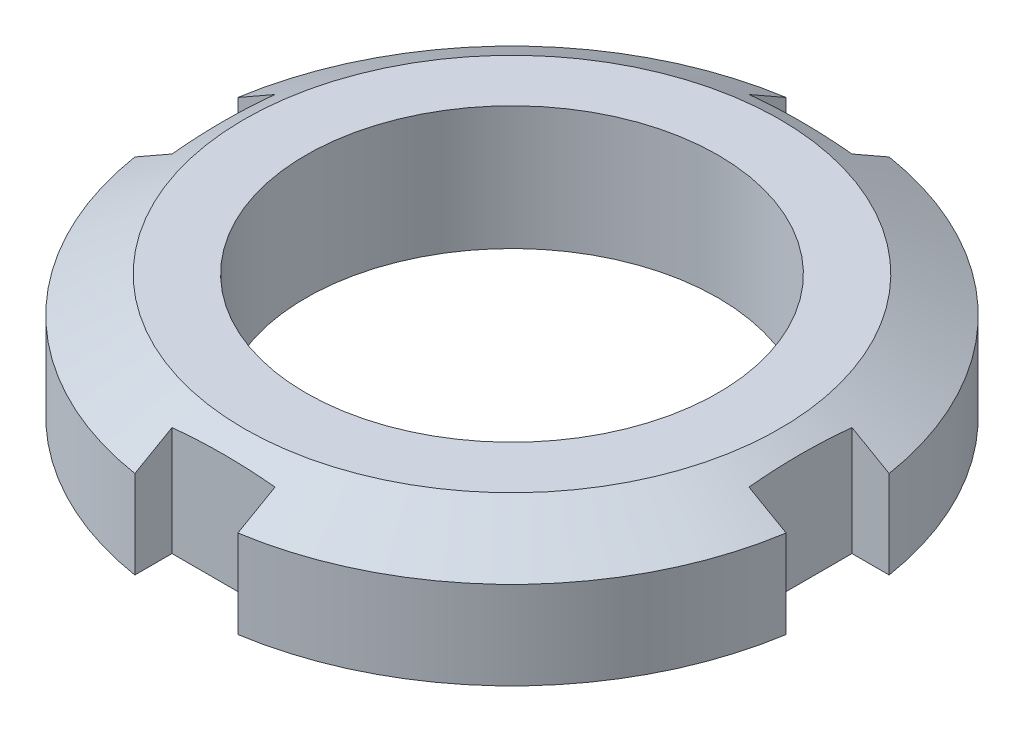
ISO-10303-21;
HEADER;
FILE_DESCRIPTION(('STEP AP214'),'2;1');
FILE_NAME('part.step','',(''),(''),'','','');
FILE_SCHEMA(('AUTOMOTIVE_DESIGN { 1 0 10303 214 1 1 1 1 }'));
ENDSEC;
DATA;
#1=APPLICATION_CONTEXT('core data for automotive mechanical design processes');
#2=APPLICATION_PROTOCOL_DEFINITION('international standard','automotive_design',2000,#1);
#3=PRODUCT_CONTEXT('',#1,'mechanical');
#4=PRODUCT('Part','Part','',(#3));
#5=PRODUCT_RELATED_PRODUCT_CATEGORY('part','',(#4));
#6=PRODUCT_DEFINITION_FORMATION('','',#4);
#7=PRODUCT_DEFINITION_CONTEXT('part definition',#1,'design');
#8=PRODUCT_DEFINITION('design','',#6,#7);
#9=PRODUCT_DEFINITION_SHAPE('','',#8);
#10=(LENGTH_UNIT() NAMED_UNIT(*) SI_UNIT(.MILLI.,.METRE.));
#11=(NAMED_UNIT(*) PLANE_ANGLE_UNIT() SI_UNIT($,.RADIAN.));
#12=(NAMED_UNIT(*) SI_UNIT($,.STERADIAN.) SOLID_ANGLE_UNIT());
#13=UNCERTAINTY_MEASURE_WITH_UNIT(LENGTH_MEASURE(1.E-05),#10,'distance_accuracy_value','');
#14=(GEOMETRIC_REPRESENTATION_CONTEXT(3) GLOBAL_UNCERTAINTY_ASSIGNED_CONTEXT((#13)) GLOBAL_UNIT_ASSIGNED_CONTEXT((#10,
#11,#12)) REPRESENTATION_CONTEXT('',''));
#15=CARTESIAN_POINT('',(0.,0.,0.));
#16=DIRECTION('',(0.,0.,1.));
#17=DIRECTION('',(1.,0.,0.));
#18=AXIS2_PLACEMENT_3D('',#15,#16,#17);
#19=CARTESIAN_POINT('',(0.,6.,0.));
#20=DIRECTION('',(0.,-1.,0.));
#21=DIRECTION('',(0.,0.,-1.));
#22=AXIS2_PLACEMENT_3D('',#19,#20,#21);
#23=CYLINDRICAL_SURFACE('',#22,16.);
#24=DIRECTION('',(0.,-1.,0.));
#25=VECTOR('',#24,1.);
#26=CARTESIAN_POINT('',(-2.5,6.,15.8034806292791));
#27=LINE('',#26,#25);
#28=CARTESIAN_POINT('',(-2.5,0.,15.8034806292791));
#29=VERTEX_POINT('',#28);
#30=CARTESIAN_POINT('',(-2.5,4.26794919243115,15.8034806292791));
#31=VERTEX_POINT('',#30);
#32=EDGE_CURVE('E174',#29,#31,#27,.F.);
#33=ORIENTED_EDGE('',*,*,#32,.T.);
#34=CARTESIAN_POINT('',(0.,4.26794919243115,0.));
#35=DIRECTION('',(0.,1.,0.));
#36=DIRECTION('',(0.,0.,1.));
#37=AXIS2_PLACEMENT_3D('',#34,#35,#36);
#38=CIRCLE('',#37,16.);
#39=CARTESIAN_POINT('',(-15.8034806292791,4.26794919243115,2.5));
#40=VERTEX_POINT('',#39);
#41=EDGE_CURVE('E169',#40,#31,#38,.T.);
#42=ORIENTED_EDGE('',*,*,#41,.F.);
#43=DIRECTION('',(0.,-1.,0.));
#44=VECTOR('',#43,1.);
#45=CARTESIAN_POINT('',(-15.8034806292791,6.,2.5));
#46=LINE('',#45,#44);
#47=CARTESIAN_POINT('',(-15.8034806292791,0.,2.5));
#48=VERTEX_POINT('',#47);
#49=EDGE_CURVE('E200',#40,#48,#46,.T.);
#50=ORIENTED_EDGE('',*,*,#49,.T.);
#51=CARTESIAN_POINT('',(0.,0.,0.));
#52=DIRECTION('',(0.,1.,0.));
#53=DIRECTION('',(0.,0.,1.));
#54=AXIS2_PLACEMENT_3D('',#51,#52,#53);
#55=CIRCLE('',#54,16.);
#56=EDGE_CURVE('E195',#48,#29,#55,.T.);
#57=ORIENTED_EDGE('',*,*,#56,.T.);
#58=EDGE_LOOP('',(#33,#42,#50,#57));
#59=FACE_BOUND('',#58,.T.);
#60=ADVANCED_FACE('F32',(#59),#23,.T.);
#61=DIRECTION('',(0.,-1.,0.));
#62=VECTOR('',#61,1.);
#63=CARTESIAN_POINT('',(2.5,6.,-15.8034806292791));
#64=LINE('',#63,#62);
#65=CARTESIAN_POINT('',(2.5,0.,-15.8034806292791));
#66=VERTEX_POINT('',#65);
#67=CARTESIAN_POINT('',(2.5,4.26794919243115,-15.8034806292791));
#68=VERTEX_POINT('',#67);
#69=EDGE_CURVE('E179',#66,#68,#64,.F.);
#70=ORIENTED_EDGE('',*,*,#69,.T.);
#71=CARTESIAN_POINT('',(15.8034806292791,4.26794919243115,-2.5));
#72=VERTEX_POINT('',#71);
#73=EDGE_CURVE('E167',#72,#68,#38,.T.);
#74=ORIENTED_EDGE('',*,*,#73,.F.);
#75=DIRECTION('',(0.,-1.,0.));
#76=VECTOR('',#75,1.);
#77=CARTESIAN_POINT('',(15.8034806292791,6.,-2.5));
#78=LINE('',#77,#76);
#79=CARTESIAN_POINT('',(15.8034806292791,0.,-2.5));
#80=VERTEX_POINT('',#79);
#81=EDGE_CURVE('E184',#72,#80,#78,.T.);
#82=ORIENTED_EDGE('',*,*,#81,.T.);
#83=EDGE_CURVE('E270',#80,#66,#55,.T.);
#84=ORIENTED_EDGE('',*,*,#83,.T.);
#85=EDGE_LOOP('',(#70,#74,#82,#84));
#86=FACE_BOUND('',#85,.T.);
#87=ADVANCED_FACE('F280',(#86),#23,.T.);
#88=DIRECTION('',(0.,-1.,0.));
#89=VECTOR('',#88,1.);
#90=CARTESIAN_POINT('',(-15.8034806292791,6.,-2.5));
#91=LINE('',#90,#89);
#92=CARTESIAN_POINT('',(-15.8034806292791,0.,-2.5));
#93=VERTEX_POINT('',#92);
#94=CARTESIAN_POINT('',(-15.8034806292791,4.26794919243115,-2.5));
#95=VERTEX_POINT('',#94);
#96=EDGE_CURVE('E58',#93,#95,#91,.F.);
#97=ORIENTED_EDGE('',*,*,#96,.T.);
#98=CARTESIAN_POINT('',(-2.5,4.26794919243115,-15.8034806292791));
#99=VERTEX_POINT('',#98);
#100=EDGE_CURVE('E402',#99,#95,#38,.T.);
#101=ORIENTED_EDGE('',*,*,#100,.F.);
#102=DIRECTION('',(0.,-1.,0.));
#103=VECTOR('',#102,1.);
#104=CARTESIAN_POINT('',(-2.5,6.,-15.8034806292791));
#105=LINE('',#104,#103);
#106=CARTESIAN_POINT('',(-2.5,0.,-15.8034806292791));
#107=VERTEX_POINT('',#106);
#108=EDGE_CURVE('E175',#99,#107,#105,.T.);
#109=ORIENTED_EDGE('',*,*,#108,.T.);
#110=EDGE_CURVE('E273',#107,#93,#55,.T.);
#111=ORIENTED_EDGE('',*,*,#110,.T.);
#112=EDGE_LOOP('',(#97,#101,#109,#111));
#113=FACE_BOUND('',#112,.T.);
#114=ADVANCED_FACE('F385',(#113),#23,.T.);
#115=CARTESIAN_POINT('',(0.,6.,0.));
#116=DIRECTION('',(0.,1.,0.));
#117=DIRECTION('',(0.,0.,1.));
#118=AXIS2_PLACEMENT_3D('',#115,#116,#117);
#119=PLANE('',#118);
#120=CARTESIAN_POINT('',(0.,6.,0.));
#121=DIRECTION('',(0.,1.,0.));
#122=DIRECTION('',(0.,0.,1.));
#123=AXIS2_PLACEMENT_3D('',#120,#121,#122);
#124=CIRCLE('',#123,13.);
#125=CARTESIAN_POINT('',(0.,6.,13.));
#126=VERTEX_POINT('',#125);
#127=EDGE_CURVE('E166',#126,#126,#124,.T.);
#128=ORIENTED_EDGE('',*,*,#127,.T.);
#129=EDGE_LOOP('',(#128));
#130=FACE_BOUND('',#129,.T.);
#131=CARTESIAN_POINT('',(0.,6.,0.));
#132=DIRECTION('',(0.,1.,0.));
#133=DIRECTION('',(0.,0.,1.));
#134=AXIS2_PLACEMENT_3D('',#131,#132,#133);
#135=CIRCLE('',#134,10.);
#136=CARTESIAN_POINT('',(0.,6.,10.));
#137=VERTEX_POINT('',#136);
#138=EDGE_CURVE('E267',#137,#137,#135,.T.);
#139=ORIENTED_EDGE('',*,*,#138,.F.);
#140=EDGE_LOOP('',(#139));
#141=FACE_BOUND('',#140,.T.);
#142=ADVANCED_FACE('F393',(#130,#141),#119,.T.);
#143=CARTESIAN_POINT('',(0.,0.,0.));
#144=DIRECTION('',(0.,1.,0.));
#145=DIRECTION('',(0.,0.,1.));
#146=AXIS2_PLACEMENT_3D('',#143,#144,#145);
#147=PLANE('',#146);
#148=ORIENTED_EDGE('',*,*,#56,.F.);
#149=DIRECTION('',(1.,0.,0.));
#150=VECTOR('',#149,1.);
#151=CARTESIAN_POINT('',(0.,0.,2.5));
#152=LINE('',#151,#150);
#153=CARTESIAN_POINT('',(-14.,0.,2.5));
#154=VERTEX_POINT('',#153);
#155=EDGE_CURVE('E45',#48,#154,#152,.T.);
#156=ORIENTED_EDGE('',*,*,#155,.T.);
#157=DIRECTION('',(0.,0.,-1.));
#158=VECTOR('',#157,1.);
#159=CARTESIAN_POINT('',(-14.,0.,2.5));
#160=LINE('',#159,#158);
#161=CARTESIAN_POINT('',(-14.,0.,-2.5));
#162=VERTEX_POINT('',#161);
#163=EDGE_CURVE('E193',#154,#162,#160,.T.);
#164=ORIENTED_EDGE('',*,*,#163,.T.);
#165=DIRECTION('',(-1.,0.,0.));
#166=VECTOR('',#165,1.);
#167=CARTESIAN_POINT('',(-14.,0.,-2.5));
#168=LINE('',#167,#166);
#169=EDGE_CURVE('E209',#162,#93,#168,.T.);
#170=ORIENTED_EDGE('',*,*,#169,.T.);
#171=ORIENTED_EDGE('',*,*,#110,.F.);
#172=DIRECTION('',(0.,0.,1.));
#173=VECTOR('',#172,1.);
#174=CARTESIAN_POINT('',(-2.5,0.,-16.));
#175=LINE('',#174,#173);
#176=CARTESIAN_POINT('',(-2.5,0.,-14.));
#177=VERTEX_POINT('',#176);
#178=EDGE_CURVE('E250',#107,#177,#175,.T.);
#179=ORIENTED_EDGE('',*,*,#178,.T.);
#180=DIRECTION('',(1.,0.,0.));
#181=VECTOR('',#180,1.);
#182=CARTESIAN_POINT('',(-2.5,0.,-14.));
#183=LINE('',#182,#181);
#184=CARTESIAN_POINT('',(2.5,0.,-14.));
#185=VERTEX_POINT('',#184);
#186=EDGE_CURVE('E254',#177,#185,#183,.T.);
#187=ORIENTED_EDGE('',*,*,#186,.T.);
#188=DIRECTION('',(0.,0.,-1.));
#189=VECTOR('',#188,1.);
#190=CARTESIAN_POINT('',(2.5,0.,-16.));
#191=LINE('',#190,#189);
#192=EDGE_CURVE('E257',#185,#66,#191,.T.);
#193=ORIENTED_EDGE('',*,*,#192,.T.);
#194=ORIENTED_EDGE('',*,*,#83,.F.);
#195=DIRECTION('',(-1.,0.,0.));
#196=VECTOR('',#195,1.);
#197=CARTESIAN_POINT('',(14.,0.,-2.5));
#198=LINE('',#197,#196);
#199=CARTESIAN_POINT('',(14.,0.,-2.5));
#200=VERTEX_POINT('',#199);
#201=EDGE_CURVE('E231',#80,#200,#198,.T.);
#202=ORIENTED_EDGE('',*,*,#201,.T.);
#203=DIRECTION('',(0.,0.,1.));
#204=VECTOR('',#203,1.);
#205=CARTESIAN_POINT('',(14.,0.,-2.5));
#206=LINE('',#205,#204);
#207=CARTESIAN_POINT('',(14.,0.,2.5));
#208=VERTEX_POINT('',#207);
#209=EDGE_CURVE('E225',#200,#208,#206,.T.);
#210=ORIENTED_EDGE('',*,*,#209,.T.);
#211=DIRECTION('',(1.,0.,0.));
#212=VECTOR('',#211,1.);
#213=CARTESIAN_POINT('',(14.,0.,2.5));
#214=LINE('',#213,#212);
#215=CARTESIAN_POINT('',(15.8034806292791,0.,2.5));
#216=VERTEX_POINT('',#215);
#217=EDGE_CURVE('E228',#208,#216,#214,.T.);
#218=ORIENTED_EDGE('',*,*,#217,.T.);
#219=CARTESIAN_POINT('',(2.5,0.,15.8034806292791));
#220=VERTEX_POINT('',#219);
#221=EDGE_CURVE('E275',#220,#216,#55,.T.);
#222=ORIENTED_EDGE('',*,*,#221,.F.);
#223=DIRECTION('',(0.,0.,-1.));
#224=VECTOR('',#223,1.);
#225=CARTESIAN_POINT('',(2.5,0.,14.));
#226=LINE('',#225,#224);
#227=CARTESIAN_POINT('',(2.5,0.,14.));
#228=VERTEX_POINT('',#227);
#229=EDGE_CURVE('E172',#220,#228,#226,.T.);
#230=ORIENTED_EDGE('',*,*,#229,.T.);
#231=DIRECTION('',(-1.,0.,0.));
#232=VECTOR('',#231,1.);
#233=CARTESIAN_POINT('',(-2.5,0.,14.));
#234=LINE('',#233,#232);
#235=CARTESIAN_POINT('',(-2.5,0.,14.));
#236=VERTEX_POINT('',#235);
#237=EDGE_CURVE('E243',#228,#236,#234,.T.);
#238=ORIENTED_EDGE('',*,*,#237,.T.);
#239=DIRECTION('',(0.,0.,1.));
#240=VECTOR('',#239,1.);
#241=CARTESIAN_POINT('',(-2.5,0.,14.));
#242=LINE('',#241,#240);
#243=EDGE_CURVE('E238',#236,#29,#242,.T.);
#244=ORIENTED_EDGE('',*,*,#243,.T.);
#245=EDGE_LOOP('',(#148,#156,#164,#170,#171,#179,#187,#193,#194,#202,#210,#218,#222,#230,#238,#244));
#246=FACE_BOUND('',#245,.T.);
#247=CARTESIAN_POINT('',(0.,0.,0.));
#248=DIRECTION('',(0.,1.,0.));
#249=DIRECTION('',(0.,0.,1.));
#250=AXIS2_PLACEMENT_3D('',#247,#248,#249);
#251=CIRCLE('',#250,10.);
#252=CARTESIAN_POINT('',(0.,0.,10.));
#253=VERTEX_POINT('',#252);
#254=EDGE_CURVE('E264',#253,#253,#251,.T.);
#255=ORIENTED_EDGE('',*,*,#254,.T.);
#256=EDGE_LOOP('',(#255));
#257=FACE_BOUND('',#256,.T.);
#258=ADVANCED_FACE('F190',(#246,#257),#147,.F.);
#259=DIRECTION('',(0.,-1.,0.));
#260=VECTOR('',#259,1.);
#261=CARTESIAN_POINT('',(15.8034806292791,6.,2.5));
#262=LINE('',#261,#260);
#263=CARTESIAN_POINT('',(15.8034806292791,4.26794919243115,2.5));
#264=VERTEX_POINT('',#263);
#265=EDGE_CURVE('E165',#216,#264,#262,.F.);
#266=ORIENTED_EDGE('',*,*,#265,.T.);
#267=CARTESIAN_POINT('',(2.5,4.26794919243115,15.8034806292791));
#268=VERTEX_POINT('',#267);
#269=EDGE_CURVE('E151',#268,#264,#38,.T.);
#270=ORIENTED_EDGE('',*,*,#269,.F.);
#271=DIRECTION('',(0.,-1.,0.));
#272=VECTOR('',#271,1.);
#273=CARTESIAN_POINT('',(2.5,6.,15.8034806292791));
#274=LINE('',#273,#272);
#275=EDGE_CURVE('E163',#268,#220,#274,.T.);
#276=ORIENTED_EDGE('',*,*,#275,.T.);
#277=ORIENTED_EDGE('',*,*,#221,.T.);
#278=EDGE_LOOP('',(#266,#270,#276,#277));
#279=FACE_BOUND('',#278,.T.);
#280=ADVANCED_FACE('F34',(#279),#23,.T.);
#281=CARTESIAN_POINT('',(0.,6.,0.));
#282=DIRECTION('',(0.,-1.,0.));
#283=DIRECTION('',(0.,0.,-1.));
#284=AXIS2_PLACEMENT_3D('',#281,#282,#283);
#285=CYLINDRICAL_SURFACE('',#284,10.);
#286=ORIENTED_EDGE('',*,*,#138,.T.);
#287=EDGE_LOOP('',(#286));
#288=FACE_BOUND('',#287,.T.);
#289=ORIENTED_EDGE('',*,*,#254,.F.);
#290=EDGE_LOOP('',(#289));
#291=FACE_BOUND('',#290,.T.);
#292=ADVANCED_FACE('F378',(#288,#291),#285,.F.);
#293=CARTESIAN_POINT('',(-2.5,0.,-16.));
#294=DIRECTION('',(-1.,0.,0.));
#295=DIRECTION('',(0.,0.,1.));
#296=AXIS2_PLACEMENT_3D('',#293,#294,#295);
#297=PLANE('',#296);
#298=ORIENTED_EDGE('',*,*,#108,.F.);
#299=CARTESIAN_POINT('',(-2.5,2.16507034063233,-19.4825479552166));
#300=CARTESIAN_POINT('',(-2.5,2.5411325270176,-18.8258109962527));
#301=CARTESIAN_POINT('',(-2.5,2.91699344856974,-18.1689585290866));
#302=CARTESIAN_POINT('',(-2.5,3.6680701789116,-16.8548868257767));
#303=CARTESIAN_POINT('',(-2.5,4.04328598910735,-16.1976675904365));
#304=CARTESIAN_POINT('',(-2.5,4.79283210724919,-14.8827227678909));
#305=CARTESIAN_POINT('',(-2.5,5.16716241389458,-14.2249971799435));
#306=CARTESIAN_POINT('',(-2.5,5.72765979989025,-13.2378410657639));
#307=CARTESIAN_POINT('',(-2.5,5.91432611862444,-12.9086940475096));
#308=CARTESIAN_POINT('',(-2.5,6.28723516231488,-12.2501599232052));
#309=CARTESIAN_POINT('',(-2.5,6.47347788703298,-11.9207728170201));
#310=CARTESIAN_POINT('',(-2.5,6.65946332694878,-11.5912403111433));
#311=B_SPLINE_CURVE_WITH_KNOTS('',3,(#299,#300,#301,#302,#303,#304,#305,#306,#307,#308,#309,
#310),.UNSPECIFIED.,.F.,.F.,(4,2,2,2,2,4),(0.,2.27036056791115,4.54071618127297,
6.81107512745911,7.94625706885341,9.0814396483116),.UNSPECIFIED.);
#312=CARTESIAN_POINT('',(-2.5,5.29478820829608,-14.));
#313=VERTEX_POINT('',#312);
#314=EDGE_CURVE('E210',#99,#313,#311,.T.);
#315=ORIENTED_EDGE('',*,*,#314,.T.);
#316=DIRECTION('',(0.,1.,0.));
#317=VECTOR('',#316,1.);
#318=CARTESIAN_POINT('',(-2.5,0.,-14.));
#319=LINE('',#318,#317);
#320=EDGE_CURVE('E260',#177,#313,#319,.T.);
#321=ORIENTED_EDGE('',*,*,#320,.F.);
#322=ORIENTED_EDGE('',*,*,#178,.F.);
#323=EDGE_LOOP('',(#298,#315,#321,#322));
#324=FACE_BOUND('',#323,.T.);
#325=ADVANCED_FACE('F373',(#324),#297,.F.);
#326=CARTESIAN_POINT('',(2.5,0.,-16.));
#327=DIRECTION('',(1.,0.,0.));
#328=DIRECTION('',(0.,0.,-1.));
#329=AXIS2_PLACEMENT_3D('',#326,#327,#328);
#330=PLANE('',#329);
#331=DIRECTION('',(0.,1.,0.));
#332=VECTOR('',#331,1.);
#333=CARTESIAN_POINT('',(2.5,0.,-14.));
#334=LINE('',#333,#332);
#335=CARTESIAN_POINT('',(2.5,5.29478820829608,-14.));
#336=VERTEX_POINT('',#335);
#337=EDGE_CURVE('E261',#185,#336,#334,.T.);
#338=ORIENTED_EDGE('',*,*,#337,.T.);
#339=CARTESIAN_POINT('',(2.5,6.65946332694879,-11.5912403111433));
#340=CARTESIAN_POINT('',(2.5,6.47347788703297,-11.9207728170201));
#341=CARTESIAN_POINT('',(2.5,6.28723516231488,-12.2501599232052));
#342=CARTESIAN_POINT('',(2.5,5.91432611862444,-12.9086940475096));
#343=CARTESIAN_POINT('',(2.5,5.72765979989025,-13.2378410657639));
#344=CARTESIAN_POINT('',(2.5,5.16716241389458,-14.2249971799435));
#345=CARTESIAN_POINT('',(2.5,4.79283210724919,-14.8827227678909));
#346=CARTESIAN_POINT('',(2.5,4.04328598910735,-16.1976675904365));
#347=CARTESIAN_POINT('',(2.5,3.6680701789116,-16.8548868257767));
#348=CARTESIAN_POINT('',(2.5,2.91699344856974,-18.1689585290866));
#349=CARTESIAN_POINT('',(2.5,2.5411325270176,-18.8258109962527));
#350=CARTESIAN_POINT('',(2.5,2.16507034063233,-19.4825479552166));
#351=B_SPLINE_CURVE_WITH_KNOTS('',3,(#339,#340,#341,#342,#343,#344,#345,#346,#347,#348,#349,
#350),.UNSPECIFIED.,.F.,.F.,(4,2,2,2,2,4),(0.,1.13518257945819,2.27036452085248,
4.54072346703862,6.81107908040045,9.0814396483116),.UNSPECIFIED.);
#352=EDGE_CURVE('E214',#336,#68,#351,.T.);
#353=ORIENTED_EDGE('',*,*,#352,.T.);
#354=ORIENTED_EDGE('',*,*,#69,.F.);
#355=ORIENTED_EDGE('',*,*,#192,.F.);
#356=EDGE_LOOP('',(#338,#353,#354,#355));
#357=FACE_BOUND('',#356,.T.);
#358=ADVANCED_FACE('F286',(#357),#330,.F.);
#359=CARTESIAN_POINT('',(-2.5,0.,-14.));
#360=DIRECTION('',(0.,0.,1.));
#361=DIRECTION('',(1.,0.,0.));
#362=AXIS2_PLACEMENT_3D('',#359,#360,#361);
#363=PLANE('',#362);
#364=ORIENTED_EDGE('',*,*,#320,.T.);
#365=CARTESIAN_POINT('',(-12.1189175023794,2.81493204217096,-14.));
#366=CARTESIAN_POINT('',(-11.7019924380798,2.97242966549874,-14.));
#367=CARTESIAN_POINT('',(-11.2835287957446,3.12594849195286,-14.));
#368=CARTESIAN_POINT('',(-10.4430765526394,3.42344320383286,-14.));
#369=CARTESIAN_POINT('',(-10.0210868503731,3.56741597133575,-14.));
#370=CARTESIAN_POINT('',(-9.17144133466471,3.84476981843219,-14.));
#371=CARTESIAN_POINT('',(-8.74376832670643,3.9780987275689,-14.));
#372=CARTESIAN_POINT('',(-7.88455923039116,4.23140127117242,-14.));
#373=CARTESIAN_POINT('',(-7.45302349100348,4.3513760991842,-14.));
#374=CARTESIAN_POINT('',(-6.17788887052795,4.68132180828034,-14.));
#375=CARTESIAN_POINT('',(-5.32841988194901,4.86982344902222,-14.));
#376=CARTESIAN_POINT('',(-4.04508804760457,5.09530424297949,-14.));
#377=CARTESIAN_POINT('',(-3.61615928689895,5.16088761741487,-14.));
#378=CARTESIAN_POINT('',(-2.75560182306364,5.27112270733664,-14.));
#379=CARTESIAN_POINT('',(-2.32397340142526,5.31577656943563,-14.));
#380=CARTESIAN_POINT('',(-1.57551921083756,5.37363929211549,-14.));
#381=CARTESIAN_POINT('',(-1.25908941123567,5.39207848234424,-14.));
#382=CARTESIAN_POINT('',(-0.625755699488492,5.41663526653947,-14.));
#383=CARTESIAN_POINT('',(-0.308851807370895,5.42275336706845,-14.));
#384=CARTESIAN_POINT('',(0.325190742547927,5.42254334299729,-14.));
#385=CARTESIAN_POINT('',(0.64232939599321,5.41620576915959,-14.));
#386=CARTESIAN_POINT('',(1.2761151752631,5.39119353088237,-14.));
#387=CARTESIAN_POINT('',(1.59276230392054,5.37251893781202,-14.));
#388=CARTESIAN_POINT('',(2.23181598629316,5.3226719583343,-14.));
#389=CARTESIAN_POINT('',(2.55420244203878,5.29124318921509,-14.));
#390=CARTESIAN_POINT('',(3.19760953994565,5.21649707166657,-14.));
#391=CARTESIAN_POINT('',(3.51863008558635,5.17317889680169,-14.));
#392=CARTESIAN_POINT('',(4.15866412234546,5.07546163449521,-14.));
#393=CARTESIAN_POINT('',(4.47767919297369,5.02107281546876,-14.));
#394=CARTESIAN_POINT('',(5.11373051209544,4.90207409265497,-14.));
#395=CARTESIAN_POINT('',(5.43076717267612,4.83746639663069,-14.));
#396=CARTESIAN_POINT('',(5.74674824775161,4.76817945796893,-14.));
#397=B_SPLINE_CURVE_WITH_KNOTS('',3,(#365,#366,#367,#368,#369,#370,#371,#372,#373,#374,#375,
#376,#377,#378,#379,#380,#381,#382,#383,#384,#385,#386,#387,#388,#389,#390,#391,#392,#393,#394,
#395,#396),.UNSPECIFIED.,.F.,.F.,(4,2,2,2,2,2,2,2,2,2,2,2,2,2,2,4),(0.,1.33707055347523,
2.67457568978561,4.01827847837507,5.36186107451758,7.96896390144178,9.27029621011378,
10.5714950198354,11.5221753550948,12.4728166038085,13.4241793150582,14.3755365227611,
15.3470480863248,16.3186271970099,17.2893092068677,18.2597817890196),.UNSPECIFIED.);
#398=EDGE_CURVE('E293',#313,#336,#397,.T.);
#399=ORIENTED_EDGE('',*,*,#398,.T.);
#400=ORIENTED_EDGE('',*,*,#337,.F.);
#401=ORIENTED_EDGE('',*,*,#186,.F.);
#402=EDGE_LOOP('',(#364,#399,#400,#401));
#403=FACE_BOUND('',#402,.T.);
#404=ADVANCED_FACE('F291',(#403),#363,.F.);
#405=CARTESIAN_POINT('',(-2.5,0.,14.));
#406=DIRECTION('',(-1.,0.,0.));
#407=DIRECTION('',(0.,0.,1.));
#408=AXIS2_PLACEMENT_3D('',#405,#406,#407);
#409=PLANE('',#408);
#410=DIRECTION('',(0.,1.,0.));
#411=VECTOR('',#410,1.);
#412=CARTESIAN_POINT('',(-2.5,0.,14.));
#413=LINE('',#412,#411);
#414=CARTESIAN_POINT('',(-2.5,5.29478820829608,14.));
#415=VERTEX_POINT('',#414);
#416=EDGE_CURVE('E247',#236,#415,#413,.T.);
#417=ORIENTED_EDGE('',*,*,#416,.T.);
#418=CARTESIAN_POINT('',(-2.5,7.34119933050626,10.3801631471322));
#419=CARTESIAN_POINT('',(-2.5,7.15597967127348,10.7101279941343));
#420=CARTESIAN_POINT('',(-2.5,6.97040843909757,11.0398951212743));
#421=CARTESIAN_POINT('',(-2.5,6.59869651618256,11.6991078653206));
#422=CARTESIAN_POINT('',(-2.5,6.41255582604503,12.028553482566));
#423=CARTESIAN_POINT('',(-2.5,5.85348084485253,13.0165176512058));
#424=CARTESIAN_POINT('',(-2.5,5.47989231555224,13.6746658798882));
#425=CARTESIAN_POINT('',(-2.5,4.7315958527932,14.990322844317));
#426=CARTESIAN_POINT('',(-2.5,4.35688792225582,15.6478315817264));
#427=CARTESIAN_POINT('',(-2.5,3.60667349540547,16.9623965380085));
#428=CARTESIAN_POINT('',(-2.5,3.23116699622715,17.6194527552464));
#429=CARTESIAN_POINT('',(-2.5,2.85542346530015,18.2763729780794));
#430=B_SPLINE_CURVE_WITH_KNOTS('',3,(#418,#419,#420,#421,#422,#423,#424,#425,#426,#427,#428,
#429),.UNSPECIFIED.,.F.,.F.,(4,2,2,2,2,4),(0.,1.13518568331668,2.27037016786421,
4.54073101281753,6.81108593784519,9.08144902292915),.UNSPECIFIED.);
#431=EDGE_CURVE('E158',#415,#31,#430,.T.);
#432=ORIENTED_EDGE('',*,*,#431,.T.);
#433=ORIENTED_EDGE('',*,*,#32,.F.);
#434=ORIENTED_EDGE('',*,*,#243,.F.);
#435=EDGE_LOOP('',(#417,#432,#433,#434));
#436=FACE_BOUND('',#435,.T.);
#437=ADVANCED_FACE('F366',(#436),#409,.F.);
#438=CARTESIAN_POINT('',(2.5,0.,14.));
#439=DIRECTION('',(1.,0.,0.));
#440=DIRECTION('',(0.,0.,-1.));
#441=AXIS2_PLACEMENT_3D('',#438,#439,#440);
#442=PLANE('',#441);
#443=ORIENTED_EDGE('',*,*,#275,.F.);
#444=CARTESIAN_POINT('',(2.5,2.85542346530015,18.2763729780794));
#445=CARTESIAN_POINT('',(2.5,3.23116699622709,17.6194527552465));
#446=CARTESIAN_POINT('',(2.5,3.60667349540536,16.9623965380087));
#447=CARTESIAN_POINT('',(2.5,4.35688792225561,15.6478315817268));
#448=CARTESIAN_POINT('',(2.5,4.73159585279293,14.9903228443174));
#449=CARTESIAN_POINT('',(2.5,5.47989231555197,13.6746658798887));
#450=CARTESIAN_POINT('',(2.5,5.85348084485232,13.0165176512062));
#451=CARTESIAN_POINT('',(2.5,6.41255582604489,12.0285534825662));
#452=CARTESIAN_POINT('',(2.5,6.59869651618245,11.6991078653208));
#453=CARTESIAN_POINT('',(2.5,6.97040843909751,11.0398951212744));
#454=CARTESIAN_POINT('',(2.5,7.15597967127345,10.7101279941343));
#455=CARTESIAN_POINT('',(2.5,7.34119933050625,10.3801631471322));
#456=B_SPLINE_CURVE_WITH_KNOTS('',3,(#444,#445,#446,#447,#448,#449,#450,#451,#452,#453,#454,
#455),.UNSPECIFIED.,.F.,.F.,(4,2,2,2,2,4),(0.,2.27036308508364,4.54071801011097,
6.81107885506462,7.94626333961231,9.08144902292915),.UNSPECIFIED.);
#457=CARTESIAN_POINT('',(2.5,5.29478820829608,14.));
#458=VERTEX_POINT('',#457);
#459=EDGE_CURVE('E148',#268,#458,#456,.T.);
#460=ORIENTED_EDGE('',*,*,#459,.T.);
#461=DIRECTION('',(0.,1.,0.));
#462=VECTOR('',#461,1.);
#463=CARTESIAN_POINT('',(2.5,0.,14.));
#464=LINE('',#463,#462);
#465=EDGE_CURVE('E246',#228,#458,#464,.T.);
#466=ORIENTED_EDGE('',*,*,#465,.F.);
#467=ORIENTED_EDGE('',*,*,#229,.F.);
#468=EDGE_LOOP('',(#443,#460,#466,#467));
#469=FACE_BOUND('',#468,.T.);
#470=ADVANCED_FACE('F170',(#469),#442,.F.);
#471=CARTESIAN_POINT('',(-2.5,0.,14.));
#472=DIRECTION('',(0.,0.,-1.));
#473=DIRECTION('',(-1.,0.,0.));
#474=AXIS2_PLACEMENT_3D('',#471,#472,#473);
#475=PLANE('',#474);
#476=ORIENTED_EDGE('',*,*,#465,.T.);
#477=CARTESIAN_POINT('',(5.74674824775161,4.76817945796893,14.));
#478=CARTESIAN_POINT('',(5.43076717267613,4.83746639663069,14.));
#479=CARTESIAN_POINT('',(5.11373051209544,4.90207409265497,14.));
#480=CARTESIAN_POINT('',(4.47767919297369,5.02107281546876,14.));
#481=CARTESIAN_POINT('',(4.15866412234546,5.07546163449521,14.));
#482=CARTESIAN_POINT('',(3.51863008558636,5.17317889680169,14.));
#483=CARTESIAN_POINT('',(3.19760953994566,5.21649707166656,14.));
#484=CARTESIAN_POINT('',(2.55420244203879,5.29124318921509,14.));
#485=CARTESIAN_POINT('',(2.23181598629317,5.3226719583343,14.));
#486=CARTESIAN_POINT('',(1.59276230392055,5.37251893781202,14.));
#487=CARTESIAN_POINT('',(1.27611517526311,5.39119353088237,14.));
#488=CARTESIAN_POINT('',(0.642329395993215,5.41620576915959,14.));
#489=CARTESIAN_POINT('',(0.325190742547932,5.42254334299729,14.));
#490=CARTESIAN_POINT('',(-0.30885180737089,5.42275336706845,14.));
#491=CARTESIAN_POINT('',(-0.625755699488486,5.41663526653947,14.));
#492=CARTESIAN_POINT('',(-1.25908941123566,5.39207848234424,14.));
#493=CARTESIAN_POINT('',(-1.57551921083755,5.37363929211549,14.));
#494=CARTESIAN_POINT('',(-2.32397340142526,5.31577656943563,14.));
#495=CARTESIAN_POINT('',(-2.75560182306364,5.27112270733664,14.));
#496=CARTESIAN_POINT('',(-3.61615928689895,5.16088761741487,14.));
#497=CARTESIAN_POINT('',(-4.04508804760457,5.09530424297949,14.));
#498=CARTESIAN_POINT('',(-5.32841988194901,4.86982344902222,14.));
#499=CARTESIAN_POINT('',(-6.17788887052795,4.68132180828034,14.));
#500=CARTESIAN_POINT('',(-7.45302349100348,4.3513760991842,14.));
#501=CARTESIAN_POINT('',(-7.88455923039116,4.23140127117242,14.));
#502=CARTESIAN_POINT('',(-8.74376832670643,3.9780987275689,14.));
#503=CARTESIAN_POINT('',(-9.17144133466471,3.84476981843219,14.));
#504=CARTESIAN_POINT('',(-10.0210868503731,3.56741597133575,14.));
#505=CARTESIAN_POINT('',(-10.4430765526394,3.42344320383286,14.));
#506=CARTESIAN_POINT('',(-11.2835287957446,3.12594849195286,14.));
#507=CARTESIAN_POINT('',(-11.7019924380798,2.97242966549874,14.));
#508=CARTESIAN_POINT('',(-12.1189175023794,2.81493204217096,14.));
#509=B_SPLINE_CURVE_WITH_KNOTS('',3,(#477,#478,#479,#480,#481,#482,#483,#484,#485,#486,#487,
#488,#489,#490,#491,#492,#493,#494,#495,#496,#497,#498,#499,#500,#501,#502,#503,#504,#505,#506,
#507,#508),.UNSPECIFIED.,.F.,.F.,(4,2,2,2,2,2,2,2,2,2,2,2,2,2,2,4),(0.,0.970472582151847,
1.94115459200967,2.91273370269475,3.88424526625852,4.83560247396136,5.78696518521113,
6.73760643392483,7.68828676918424,8.98948557890582,10.2908178875778,12.897920714502,
14.2415033106445,15.585206099234,16.9227112355444,18.2597817890196),.UNSPECIFIED.);
#510=EDGE_CURVE('E154',#458,#415,#509,.T.);
#511=ORIENTED_EDGE('',*,*,#510,.T.);
#512=ORIENTED_EDGE('',*,*,#416,.F.);
#513=ORIENTED_EDGE('',*,*,#237,.F.);
#514=EDGE_LOOP('',(#476,#511,#512,#513));
#515=FACE_BOUND('',#514,.T.);
#516=ADVANCED_FACE('F365',(#515),#475,.F.);
#517=CARTESIAN_POINT('',(14.,0.,-2.5));
#518=DIRECTION('',(0.,0.,-1.));
#519=DIRECTION('',(-1.,0.,0.));
#520=AXIS2_PLACEMENT_3D('',#517,#518,#519);
#521=PLANE('',#520);
#522=ORIENTED_EDGE('',*,*,#81,.F.);
#523=CARTESIAN_POINT('',(18.2763729780794,2.85542346530015,-2.5));
#524=CARTESIAN_POINT('',(17.6194527552465,3.23116699622709,-2.5));
#525=CARTESIAN_POINT('',(16.9623965380087,3.60667349540536,-2.5));
#526=CARTESIAN_POINT('',(15.6478315817268,4.35688792225561,-2.5));
#527=CARTESIAN_POINT('',(14.9903228443174,4.73159585279293,-2.5));
#528=CARTESIAN_POINT('',(13.6746658798887,5.47989231555197,-2.5));
#529=CARTESIAN_POINT('',(13.0165176512062,5.85348084485232,-2.5));
#530=CARTESIAN_POINT('',(12.0285534825662,6.41255582604489,-2.5));
#531=CARTESIAN_POINT('',(11.6991078653208,6.59869651618245,-2.5));
#532=CARTESIAN_POINT('',(11.0398951212744,6.97040843909751,-2.5));
#533=CARTESIAN_POINT('',(10.7101279941343,7.15597967127345,-2.5));
#534=CARTESIAN_POINT('',(10.3801631471322,7.34119933050625,-2.5));
#535=B_SPLINE_CURVE_WITH_KNOTS('',3,(#523,#524,#525,#526,#527,#528,#529,#530,#531,#532,#533,
#534),.UNSPECIFIED.,.F.,.F.,(4,2,2,2,2,4),(0.,2.27036308508364,4.54071801011097,
6.81107885506462,7.94626333961231,9.08144902292915),.UNSPECIFIED.);
#536=CARTESIAN_POINT('',(14.,5.29478820829608,-2.5));
#537=VERTEX_POINT('',#536);
#538=EDGE_CURVE('E346',#72,#537,#535,.T.);
#539=ORIENTED_EDGE('',*,*,#538,.T.);
#540=DIRECTION('',(0.,1.,0.));
#541=VECTOR('',#540,1.);
#542=CARTESIAN_POINT('',(14.,0.,-2.5));
#543=LINE('',#542,#541);
#544=EDGE_CURVE('E235',#200,#537,#543,.T.);
#545=ORIENTED_EDGE('',*,*,#544,.F.);
#546=ORIENTED_EDGE('',*,*,#201,.F.);
#547=EDGE_LOOP('',(#522,#539,#545,#546));
#548=FACE_BOUND('',#547,.T.);
#549=ADVANCED_FACE('F426',(#548),#521,.F.);
#550=CARTESIAN_POINT('',(14.,0.,2.5));
#551=DIRECTION('',(0.,0.,1.));
#552=DIRECTION('',(1.,0.,0.));
#553=AXIS2_PLACEMENT_3D('',#550,#551,#552);
#554=PLANE('',#553);
#555=DIRECTION('',(0.,1.,0.));
#556=VECTOR('',#555,1.);
#557=CARTESIAN_POINT('',(14.,0.,2.5));
#558=LINE('',#557,#556);
#559=CARTESIAN_POINT('',(14.,5.29478820829608,2.5));
#560=VERTEX_POINT('',#559);
#561=EDGE_CURVE('E234',#208,#560,#558,.T.);
#562=ORIENTED_EDGE('',*,*,#561,.T.);
#563=CARTESIAN_POINT('',(10.3801631471322,7.34119933050626,2.5));
#564=CARTESIAN_POINT('',(10.7101279941343,7.15597967127348,2.5));
#565=CARTESIAN_POINT('',(11.0398951212743,6.97040843909757,2.5));
#566=CARTESIAN_POINT('',(11.6991078653206,6.59869651618256,2.5));
#567=CARTESIAN_POINT('',(12.028553482566,6.41255582604503,2.5));
#568=CARTESIAN_POINT('',(13.0165176512058,5.85348084485253,2.5));
#569=CARTESIAN_POINT('',(13.6746658798882,5.47989231555224,2.5));
#570=CARTESIAN_POINT('',(14.990322844317,4.7315958527932,2.5));
#571=CARTESIAN_POINT('',(15.6478315817264,4.35688792225582,2.5));
#572=CARTESIAN_POINT('',(16.9623965380085,3.60667349540547,2.5));
#573=CARTESIAN_POINT('',(17.6194527552464,3.23116699622715,2.5));
#574=CARTESIAN_POINT('',(18.2763729780794,2.85542346530015,2.5));
#575=B_SPLINE_CURVE_WITH_KNOTS('',3,(#563,#564,#565,#566,#567,#568,#569,#570,#571,#572,#573,
#574),.UNSPECIFIED.,.F.,.F.,(4,2,2,2,2,4),(0.,1.13518568331668,2.27037016786421,
4.54073101281753,6.81108593784519,9.08144902292915),.UNSPECIFIED.);
#576=EDGE_CURVE('E339',#560,#264,#575,.T.);
#577=ORIENTED_EDGE('',*,*,#576,.T.);
#578=ORIENTED_EDGE('',*,*,#265,.F.);
#579=ORIENTED_EDGE('',*,*,#217,.F.);
#580=EDGE_LOOP('',(#562,#577,#578,#579));
#581=FACE_BOUND('',#580,.T.);
#582=ADVANCED_FACE('F423',(#581),#554,.F.);
#583=CARTESIAN_POINT('',(14.,0.,-2.5));
#584=DIRECTION('',(-1.,0.,0.));
#585=DIRECTION('',(0.,0.,1.));
#586=AXIS2_PLACEMENT_3D('',#583,#584,#585);
#587=PLANE('',#586);
#588=ORIENTED_EDGE('',*,*,#544,.T.);
#589=CARTESIAN_POINT('',(14.,2.81493204217096,-12.1189175023794));
#590=CARTESIAN_POINT('',(14.,2.97242966549874,-11.7019924380798));
#591=CARTESIAN_POINT('',(14.,3.12594849195286,-11.2835287957446));
#592=CARTESIAN_POINT('',(14.,3.42344320383286,-10.4430765526394));
#593=CARTESIAN_POINT('',(14.,3.56741597133575,-10.0210868503731));
#594=CARTESIAN_POINT('',(14.,3.84476981843219,-9.17144133466471));
#595=CARTESIAN_POINT('',(14.,3.9780987275689,-8.74376832670643));
#596=CARTESIAN_POINT('',(14.,4.23140127117242,-7.88455923039116));
#597=CARTESIAN_POINT('',(14.,4.3513760991842,-7.45302349100348));
#598=CARTESIAN_POINT('',(14.,4.68132180828034,-6.17788887052795));
#599=CARTESIAN_POINT('',(14.,4.86982344902222,-5.32841988194901));
#600=CARTESIAN_POINT('',(14.,5.09530424297949,-4.04508804760457));
#601=CARTESIAN_POINT('',(14.,5.16088761741487,-3.61615928689895));
#602=CARTESIAN_POINT('',(14.,5.27112270733664,-2.75560182306364));
#603=CARTESIAN_POINT('',(14.,5.31577656943563,-2.32397340142526));
#604=CARTESIAN_POINT('',(14.,5.37363929211549,-1.57551921083756));
#605=CARTESIAN_POINT('',(14.,5.39207848234424,-1.25908941123566));
#606=CARTESIAN_POINT('',(14.,5.41663526653947,-0.625755699488488));
#607=CARTESIAN_POINT('',(14.,5.42275336706845,-0.308851807370892));
#608=CARTESIAN_POINT('',(14.,5.42254334299729,0.325190742547929));
#609=CARTESIAN_POINT('',(14.,5.41620576915959,0.642329395993212));
#610=CARTESIAN_POINT('',(14.,5.39119353088237,1.2761151752631));
#611=CARTESIAN_POINT('',(14.,5.37251893781202,1.59276230392054));
#612=CARTESIAN_POINT('',(14.,5.3226719583343,2.23181598629317));
#613=CARTESIAN_POINT('',(14.,5.29124318921509,2.55420244203878));
#614=CARTESIAN_POINT('',(14.,5.21649707166656,3.19760953994565));
#615=CARTESIAN_POINT('',(14.,5.17317889680169,3.51863008558635));
#616=CARTESIAN_POINT('',(14.,5.07546163449521,4.15866412234546));
#617=CARTESIAN_POINT('',(14.,5.02107281546876,4.47767919297369));
#618=CARTESIAN_POINT('',(14.,4.90207409265497,5.11373051209544));
#619=CARTESIAN_POINT('',(14.,4.83746639663069,5.43076717267612));
#620=CARTESIAN_POINT('',(14.,4.76817945796893,5.74674824775161));
#621=B_SPLINE_CURVE_WITH_KNOTS('',3,(#589,#590,#591,#592,#593,#594,#595,#596,#597,#598,#599,
#600,#601,#602,#603,#604,#605,#606,#607,#608,#609,#610,#611,#612,#613,#614,#615,#616,#617,#618,
#619,#620),.UNSPECIFIED.,.F.,.F.,(4,2,2,2,2,2,2,2,2,2,2,2,2,2,2,4),(0.,1.33707055347523,
2.67457568978561,4.01827847837507,5.36186107451758,7.96896390144178,9.27029621011378,
10.5714950198354,11.5221753550948,12.4728166038085,13.4241793150582,14.3755365227611,
15.3470480863248,16.3186271970099,17.2893092068677,18.2597817890196),.UNSPECIFIED.);
#622=EDGE_CURVE('E332',#537,#560,#621,.T.);
#623=ORIENTED_EDGE('',*,*,#622,.T.);
#624=ORIENTED_EDGE('',*,*,#561,.F.);
#625=ORIENTED_EDGE('',*,*,#209,.F.);
#626=EDGE_LOOP('',(#588,#623,#624,#625));
#627=FACE_BOUND('',#626,.T.);
#628=ADVANCED_FACE('F424',(#627),#587,.F.);
#629=CARTESIAN_POINT('',(-14.,0.,2.5));
#630=DIRECTION('',(0.,0.,1.));
#631=DIRECTION('',(1.,0.,0.));
#632=AXIS2_PLACEMENT_3D('',#629,#630,#631);
#633=PLANE('',#632);
#634=ORIENTED_EDGE('',*,*,#49,.F.);
#635=CARTESIAN_POINT('',(-19.4825479552166,2.16507034063233,2.5));
#636=CARTESIAN_POINT('',(-18.8258109962527,2.5411325270176,2.5));
#637=CARTESIAN_POINT('',(-18.1689585290866,2.91699344856974,2.5));
#638=CARTESIAN_POINT('',(-16.8548868257767,3.6680701789116,2.5));
#639=CARTESIAN_POINT('',(-16.1976675904365,4.04328598910735,2.5));
#640=CARTESIAN_POINT('',(-14.8827227678909,4.79283210724919,2.5));
#641=CARTESIAN_POINT('',(-14.2249971799435,5.16716241389458,2.5));
#642=CARTESIAN_POINT('',(-13.2378410657639,5.72765979989025,2.5));
#643=CARTESIAN_POINT('',(-12.9086940475096,5.91432611862444,2.5));
#644=CARTESIAN_POINT('',(-12.2501599232052,6.28723516231488,2.5));
#645=CARTESIAN_POINT('',(-11.9207728170201,6.47347788703298,2.5));
#646=CARTESIAN_POINT('',(-11.5912403111433,6.65946332694878,2.5));
#647=B_SPLINE_CURVE_WITH_KNOTS('',3,(#635,#636,#637,#638,#639,#640,#641,#642,#643,#644,#645,
#646),.UNSPECIFIED.,.F.,.F.,(4,2,2,2,2,4),(0.,2.27036056791115,4.54071618127297,
6.81107512745911,7.94625706885341,9.0814396483116),.UNSPECIFIED.);
#648=CARTESIAN_POINT('',(-14.,5.29478820829608,2.5));
#649=VERTEX_POINT('',#648);
#650=EDGE_CURVE('E203',#40,#649,#647,.T.);
#651=ORIENTED_EDGE('',*,*,#650,.T.);
#652=DIRECTION('',(0.,1.,0.));
#653=VECTOR('',#652,1.);
#654=CARTESIAN_POINT('',(-14.,0.,2.5));
#655=LINE('',#654,#653);
#656=EDGE_CURVE('E202',#154,#649,#655,.T.);
#657=ORIENTED_EDGE('',*,*,#656,.F.);
#658=ORIENTED_EDGE('',*,*,#155,.F.);
#659=EDGE_LOOP('',(#634,#651,#657,#658));
#660=FACE_BOUND('',#659,.T.);
#661=ADVANCED_FACE('F198',(#660),#633,.F.);
#662=CARTESIAN_POINT('',(-14.,0.,-2.5));
#663=DIRECTION('',(0.,0.,-1.));
#664=DIRECTION('',(-1.,0.,0.));
#665=AXIS2_PLACEMENT_3D('',#662,#663,#664);
#666=PLANE('',#665);
#667=DIRECTION('',(0.,1.,0.));
#668=VECTOR('',#667,1.);
#669=CARTESIAN_POINT('',(-14.,0.,-2.5));
#670=LINE('',#669,#668);
#671=CARTESIAN_POINT('',(-14.,5.29478820829608,-2.5));
#672=VERTEX_POINT('',#671);
#673=EDGE_CURVE('E205',#162,#672,#670,.T.);
#674=ORIENTED_EDGE('',*,*,#673,.T.);
#675=CARTESIAN_POINT('',(-11.5912403111433,6.65946332694879,-2.5));
#676=CARTESIAN_POINT('',(-11.9207728170201,6.47347788703297,-2.5));
#677=CARTESIAN_POINT('',(-12.2501599232052,6.28723516231488,-2.5));
#678=CARTESIAN_POINT('',(-12.9086940475096,5.91432611862444,-2.5));
#679=CARTESIAN_POINT('',(-13.2378410657639,5.72765979989025,-2.5));
#680=CARTESIAN_POINT('',(-14.2249971799435,5.16716241389458,-2.5));
#681=CARTESIAN_POINT('',(-14.8827227678909,4.79283210724919,-2.5));
#682=CARTESIAN_POINT('',(-16.1976675904365,4.04328598910735,-2.5));
#683=CARTESIAN_POINT('',(-16.8548868257767,3.6680701789116,-2.5));
#684=CARTESIAN_POINT('',(-18.1689585290866,2.91699344856974,-2.5));
#685=CARTESIAN_POINT('',(-18.8258109962527,2.5411325270176,-2.5));
#686=CARTESIAN_POINT('',(-19.4825479552166,2.16507034063233,-2.5));
#687=B_SPLINE_CURVE_WITH_KNOTS('',3,(#675,#676,#677,#678,#679,#680,#681,#682,#683,#684,#685,
#686),.UNSPECIFIED.,.F.,.F.,(4,2,2,2,2,4),(0.,1.13518257945819,2.27036452085248,
4.54072346703862,6.81107908040045,9.0814396483116),.UNSPECIFIED.);
#688=EDGE_CURVE('E52',#672,#95,#687,.T.);
#689=ORIENTED_EDGE('',*,*,#688,.T.);
#690=ORIENTED_EDGE('',*,*,#96,.F.);
#691=ORIENTED_EDGE('',*,*,#169,.F.);
#692=EDGE_LOOP('',(#674,#689,#690,#691));
#693=FACE_BOUND('',#692,.T.);
#694=ADVANCED_FACE('F404',(#693),#666,.F.);
#695=CARTESIAN_POINT('',(-14.,0.,2.5));
#696=DIRECTION('',(1.,0.,0.));
#697=DIRECTION('',(0.,0.,-1.));
#698=AXIS2_PLACEMENT_3D('',#695,#696,#697);
#699=PLANE('',#698);
#700=ORIENTED_EDGE('',*,*,#656,.T.);
#701=CARTESIAN_POINT('',(-14.,4.76817945796893,5.74674824775161));
#702=CARTESIAN_POINT('',(-14.,4.83746639663069,5.43076717267613));
#703=CARTESIAN_POINT('',(-14.,4.90207409265497,5.11373051209544));
#704=CARTESIAN_POINT('',(-14.,5.02107281546876,4.47767919297369));
#705=CARTESIAN_POINT('',(-14.,5.07546163449521,4.15866412234546));
#706=CARTESIAN_POINT('',(-14.,5.17317889680169,3.51863008558636));
#707=CARTESIAN_POINT('',(-14.,5.21649707166656,3.19760953994566));
#708=CARTESIAN_POINT('',(-14.,5.29124318921509,2.55420244203879));
#709=CARTESIAN_POINT('',(-14.,5.3226719583343,2.23181598629317));
#710=CARTESIAN_POINT('',(-14.,5.37251893781202,1.59276230392055));
#711=CARTESIAN_POINT('',(-14.,5.39119353088237,1.27611517526311));
#712=CARTESIAN_POINT('',(-14.,5.41620576915959,0.642329395993215));
#713=CARTESIAN_POINT('',(-14.,5.42254334299729,0.325190742547932));
#714=CARTESIAN_POINT('',(-14.,5.42275336706845,-0.30885180737089));
#715=CARTESIAN_POINT('',(-14.,5.41663526653947,-0.625755699488486));
#716=CARTESIAN_POINT('',(-14.,5.39207848234424,-1.25908941123566));
#717=CARTESIAN_POINT('',(-14.,5.37363929211549,-1.57551921083755));
#718=CARTESIAN_POINT('',(-14.,5.31577656943563,-2.32397340142526));
#719=CARTESIAN_POINT('',(-14.,5.27112270733664,-2.75560182306364));
#720=CARTESIAN_POINT('',(-14.,5.16088761741487,-3.61615928689895));
#721=CARTESIAN_POINT('',(-14.,5.09530424297949,-4.04508804760457));
#722=CARTESIAN_POINT('',(-14.,4.86982344902222,-5.32841988194901));
#723=CARTESIAN_POINT('',(-14.,4.68132180828034,-6.17788887052795));
#724=CARTESIAN_POINT('',(-14.,4.3513760991842,-7.45302349100348));
#725=CARTESIAN_POINT('',(-14.,4.23140127117242,-7.88455923039116));
#726=CARTESIAN_POINT('',(-14.,3.9780987275689,-8.74376832670643));
#727=CARTESIAN_POINT('',(-14.,3.84476981843219,-9.17144133466471));
#728=CARTESIAN_POINT('',(-14.,3.56741597133575,-10.0210868503731));
#729=CARTESIAN_POINT('',(-14.,3.42344320383286,-10.4430765526394));
#730=CARTESIAN_POINT('',(-14.,3.12594849195286,-11.2835287957446));
#731=CARTESIAN_POINT('',(-14.,2.97242966549874,-11.7019924380798));
#732=CARTESIAN_POINT('',(-14.,2.81493204217096,-12.1189175023794));
#733=B_SPLINE_CURVE_WITH_KNOTS('',3,(#701,#702,#703,#704,#705,#706,#707,#708,#709,#710,#711,
#712,#713,#714,#715,#716,#717,#718,#719,#720,#721,#722,#723,#724,#725,#726,#727,#728,#729,#730,
#731,#732),.UNSPECIFIED.,.F.,.F.,(4,2,2,2,2,2,2,2,2,2,2,2,2,2,2,4),(0.,0.970472582151847,
1.94115459200967,2.91273370269475,3.88424526625852,4.83560247396136,5.78696518521113,
6.73760643392483,7.68828676918424,8.98948557890582,10.2908178875778,12.897920714502,
14.2415033106445,15.585206099234,16.9227112355444,18.2597817890196),.UNSPECIFIED.);
#734=EDGE_CURVE('E11',#649,#672,#733,.T.);
#735=ORIENTED_EDGE('',*,*,#734,.T.);
#736=ORIENTED_EDGE('',*,*,#673,.F.);
#737=ORIENTED_EDGE('',*,*,#163,.F.);
#738=EDGE_LOOP('',(#700,#735,#736,#737));
#739=FACE_BOUND('',#738,.T.);
#740=ADVANCED_FACE('F207',(#739),#699,.F.);
#741=CARTESIAN_POINT('',(0.,4.26794919243115,0.));
#742=DIRECTION('',(0.,-1.,0.));
#743=DIRECTION('',(0.,0.,-1.));
#744=AXIS2_PLACEMENT_3D('',#741,#742,#743);
#745=CONICAL_SURFACE('',#744,16.,1.0471975511966);
#746=ORIENTED_EDGE('',*,*,#127,.F.);
#747=EDGE_LOOP('',(#746));
#748=FACE_BOUND('',#747,.T.);
#749=ORIENTED_EDGE('',*,*,#100,.T.);
#750=ORIENTED_EDGE('',*,*,#688,.F.);
#751=ORIENTED_EDGE('',*,*,#734,.F.);
#752=ORIENTED_EDGE('',*,*,#650,.F.);
#753=ORIENTED_EDGE('',*,*,#41,.T.);
#754=ORIENTED_EDGE('',*,*,#431,.F.);
#755=ORIENTED_EDGE('',*,*,#510,.F.);
#756=ORIENTED_EDGE('',*,*,#459,.F.);
#757=ORIENTED_EDGE('',*,*,#269,.T.);
#758=ORIENTED_EDGE('',*,*,#576,.F.);
#759=ORIENTED_EDGE('',*,*,#622,.F.);
#760=ORIENTED_EDGE('',*,*,#538,.F.);
#761=ORIENTED_EDGE('',*,*,#73,.T.);
#762=ORIENTED_EDGE('',*,*,#352,.F.);
#763=ORIENTED_EDGE('',*,*,#398,.F.);
#764=ORIENTED_EDGE('',*,*,#314,.F.);
#765=EDGE_LOOP('',(#749,#750,#751,#752,#753,#754,#755,#756,#757,#758,#759,#760,#761,#762,#763,#764));
#766=FACE_BOUND('',#765,.T.);
#767=ADVANCED_FACE('F150',(#748,#766),#745,.T.);
#768=CLOSED_SHELL('',(#60,#87,#114,#142,#258,#280,#292,#325,#358,#404,#437,#470,#516,#549,#582,
#628,#661,#694,#740,#767));
#769=MANIFOLD_SOLID_BREP('B2',#768);
#770=ADVANCED_BREP_SHAPE_REPRESENTATION('',(#18,#769),#14);
#771=SHAPE_DEFINITION_REPRESENTATION(#9,#770);
ENDSEC;
END-ISO-10303-21;
